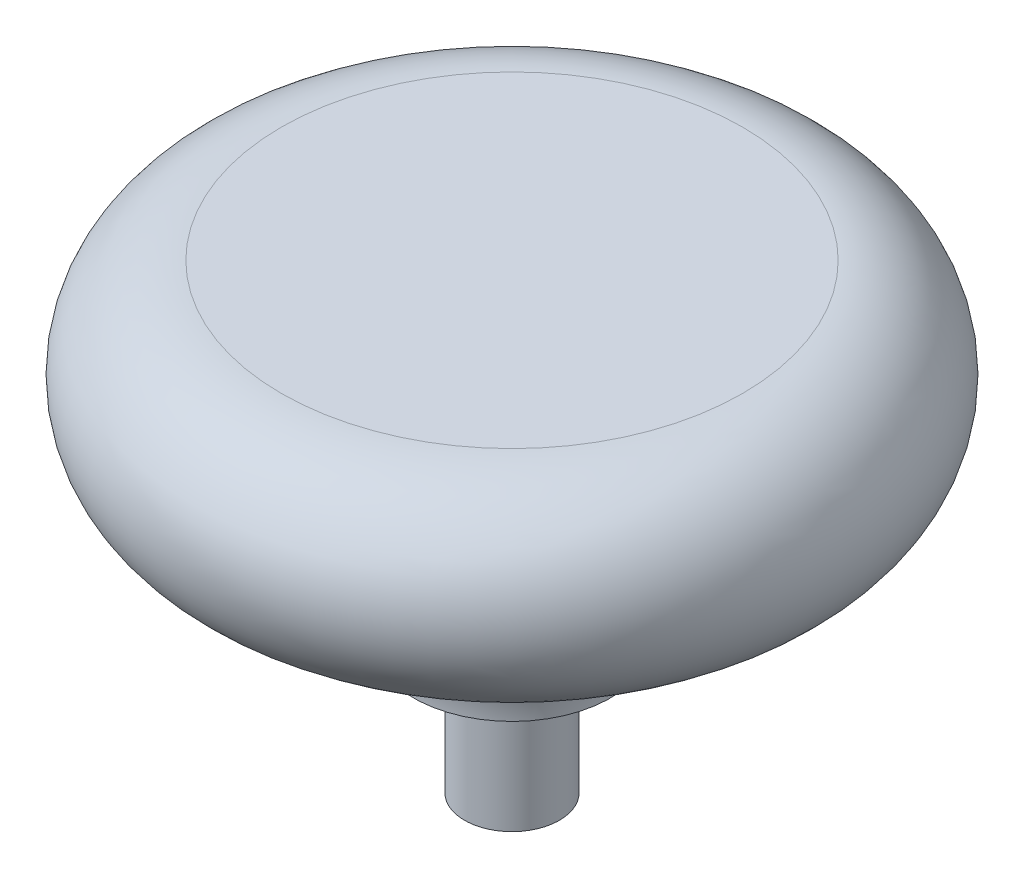
ISO-10303-21;
HEADER;
FILE_DESCRIPTION(('STEP AP214'),'2;1');
FILE_NAME('part.step','',(''),(''),'','','');
FILE_SCHEMA(('AUTOMOTIVE_DESIGN { 1 0 10303 214 1 1 1 1 }'));
ENDSEC;
DATA;
#1=APPLICATION_CONTEXT('core data for automotive mechanical design processes');
#2=APPLICATION_PROTOCOL_DEFINITION('international standard','automotive_design',2000,#1);
#3=PRODUCT_CONTEXT('',#1,'mechanical');
#4=PRODUCT('Part','Part','',(#3));
#5=PRODUCT_RELATED_PRODUCT_CATEGORY('part','',(#4));
#6=PRODUCT_DEFINITION_FORMATION('','',#4);
#7=PRODUCT_DEFINITION_CONTEXT('part definition',#1,'design');
#8=PRODUCT_DEFINITION('design','',#6,#7);
#9=PRODUCT_DEFINITION_SHAPE('','',#8);
#10=(LENGTH_UNIT() NAMED_UNIT(*) SI_UNIT(.MILLI.,.METRE.));
#11=(NAMED_UNIT(*) PLANE_ANGLE_UNIT() SI_UNIT($,.RADIAN.));
#12=(NAMED_UNIT(*) SI_UNIT($,.STERADIAN.) SOLID_ANGLE_UNIT());
#13=UNCERTAINTY_MEASURE_WITH_UNIT(LENGTH_MEASURE(1.E-05),#10,'distance_accuracy_value','');
#14=(GEOMETRIC_REPRESENTATION_CONTEXT(3) GLOBAL_UNCERTAINTY_ASSIGNED_CONTEXT((#13)) GLOBAL_UNIT_ASSIGNED_CONTEXT((#10,
#11,#12)) REPRESENTATION_CONTEXT('',''));
#15=CARTESIAN_POINT('',(0.,0.,0.));
#16=DIRECTION('',(0.,0.,1.));
#17=DIRECTION('',(1.,0.,0.));
#18=AXIS2_PLACEMENT_3D('',#15,#16,#17);
#19=CARTESIAN_POINT('',(2.286,0.,0.));
#20=DIRECTION('',(0.,1.,0.));
#21=DIRECTION('',(0.,0.,1.));
#22=AXIS2_PLACEMENT_3D('',#19,#20,#21);
#23=PLANE('',#22);
#24=CARTESIAN_POINT('',(0.,0.,0.));
#25=DIRECTION('',(0.,-1.,0.));
#26=DIRECTION('',(0.,0.,-1.));
#27=AXIS2_PLACEMENT_3D('',#24,#25,#26);
#28=CIRCLE('',#27,2.286);
#29=CARTESIAN_POINT('',(0.,0.,-2.286));
#30=VERTEX_POINT('',#29);
#31=EDGE_CURVE('E56',#30,#30,#28,.T.);
#32=ORIENTED_EDGE('',*,*,#31,.T.);
#33=EDGE_LOOP('',(#32));
#34=FACE_BOUND('',#33,.T.);
#35=ADVANCED_FACE('F37',(#34),#23,.F.);
#36=CARTESIAN_POINT('',(0.,22.225,0.));
#37=DIRECTION('',(0.,-1.,0.));
#38=DIRECTION('',(0.,0.,-1.));
#39=AXIS2_PLACEMENT_3D('',#36,#37,#38);
#40=PLANE('',#39);
#41=CARTESIAN_POINT('',(0.,22.225,0.));
#42=DIRECTION('',(0.,-1.,0.));
#43=DIRECTION('',(0.,0.,-1.));
#44=AXIS2_PLACEMENT_3D('',#41,#42,#43);
#45=CIRCLE('',#44,11.1125);
#46=CARTESIAN_POINT('',(0.,22.225,-11.1125));
#47=VERTEX_POINT('',#46);
#48=EDGE_CURVE('E10',#47,#47,#45,.T.);
#49=ORIENTED_EDGE('',*,*,#48,.F.);
#50=EDGE_LOOP('',(#49));
#51=FACE_BOUND('',#50,.T.);
#52=ADVANCED_FACE('F80',(#51),#40,.F.);
#53=CARTESIAN_POINT('',(0.,17.4625,0.));
#54=DIRECTION('',(0.,-1.,0.));
#55=DIRECTION('',(0.,0.,-1.));
#56=AXIS2_PLACEMENT_3D('',#53,#54,#55);
#57=TOROIDAL_SURFACE('',#56,11.1125,4.7625);
#58=CARTESIAN_POINT('',(0.,12.7,0.));
#59=DIRECTION('',(0.,-1.,0.));
#60=DIRECTION('',(0.,0.,-1.));
#61=AXIS2_PLACEMENT_3D('',#58,#59,#60);
#62=CIRCLE('',#61,11.1125);
#63=CARTESIAN_POINT('',(0.,12.7,-11.1125));
#64=VERTEX_POINT('',#63);
#65=EDGE_CURVE('E43',#64,#64,#62,.T.);
#66=ORIENTED_EDGE('',*,*,#65,.F.);
#67=EDGE_LOOP('',(#66));
#68=FACE_BOUND('',#67,.T.);
#69=ORIENTED_EDGE('',*,*,#48,.T.);
#70=EDGE_LOOP('',(#69));
#71=FACE_BOUND('',#70,.T.);
#72=ADVANCED_FACE('F75',(#68,#71),#57,.T.);
#73=CARTESIAN_POINT('',(0.,6.35,0.));
#74=DIRECTION('',(0.,-1.,0.));
#75=DIRECTION('',(0.,0.,-1.));
#76=AXIS2_PLACEMENT_3D('',#73,#74,#75);
#77=TOROIDAL_SURFACE('',#76,11.1125,6.35);
#78=CARTESIAN_POINT('',(0.,6.35,0.));
#79=DIRECTION('',(0.,-1.,0.));
#80=DIRECTION('',(0.,0.,-1.));
#81=AXIS2_PLACEMENT_3D('',#78,#79,#80);
#82=CIRCLE('',#81,4.7625);
#83=CARTESIAN_POINT('',(0.,6.35,-4.7625));
#84=VERTEX_POINT('',#83);
#85=EDGE_CURVE('E47',#84,#84,#82,.T.);
#86=ORIENTED_EDGE('',*,*,#85,.F.);
#87=EDGE_LOOP('',(#86));
#88=FACE_BOUND('',#87,.T.);
#89=ORIENTED_EDGE('',*,*,#65,.T.);
#90=EDGE_LOOP('',(#89));
#91=FACE_BOUND('',#90,.T.);
#92=ADVANCED_FACE('F70',(#88,#91),#77,.F.);
#93=CARTESIAN_POINT('',(4.7625,6.35,0.));
#94=DIRECTION('',(0.,1.,0.));
#95=DIRECTION('',(0.,0.,1.));
#96=AXIS2_PLACEMENT_3D('',#93,#94,#95);
#97=PLANE('',#96);
#98=CARTESIAN_POINT('',(0.,6.35,0.));
#99=DIRECTION('',(0.,-1.,0.));
#100=DIRECTION('',(0.,0.,-1.));
#101=AXIS2_PLACEMENT_3D('',#98,#99,#100);
#102=CIRCLE('',#101,2.286);
#103=CARTESIAN_POINT('',(0.,6.35,-2.286));
#104=VERTEX_POINT('',#103);
#105=EDGE_CURVE('E51',#104,#104,#102,.T.);
#106=ORIENTED_EDGE('',*,*,#105,.F.);
#107=EDGE_LOOP('',(#106));
#108=FACE_BOUND('',#107,.T.);
#109=ORIENTED_EDGE('',*,*,#85,.T.);
#110=EDGE_LOOP('',(#109));
#111=FACE_BOUND('',#110,.T.);
#112=ADVANCED_FACE('F64',(#108,#111),#97,.F.);
#113=CARTESIAN_POINT('',(0.,0.,0.));
#114=DIRECTION('',(0.,-1.,0.));
#115=DIRECTION('',(0.,0.,-1.));
#116=AXIS2_PLACEMENT_3D('',#113,#114,#115);
#117=CYLINDRICAL_SURFACE('',#116,2.286);
#118=ORIENTED_EDGE('',*,*,#31,.F.);
#119=EDGE_LOOP('',(#118));
#120=FACE_BOUND('',#119,.T.);
#121=ORIENTED_EDGE('',*,*,#105,.T.);
#122=EDGE_LOOP('',(#121));
#123=FACE_BOUND('',#122,.T.);
#124=ADVANCED_FACE('F61',(#120,#123),#117,.T.);
#125=CLOSED_SHELL('',(#35,#52,#72,#92,#112,#124));
#126=MANIFOLD_SOLID_BREP('B2',#125);
#127=ADVANCED_BREP_SHAPE_REPRESENTATION('',(#18,#126),#14);
#128=SHAPE_DEFINITION_REPRESENTATION(#9,#127);
ENDSEC;
END-ISO-10303-21;
